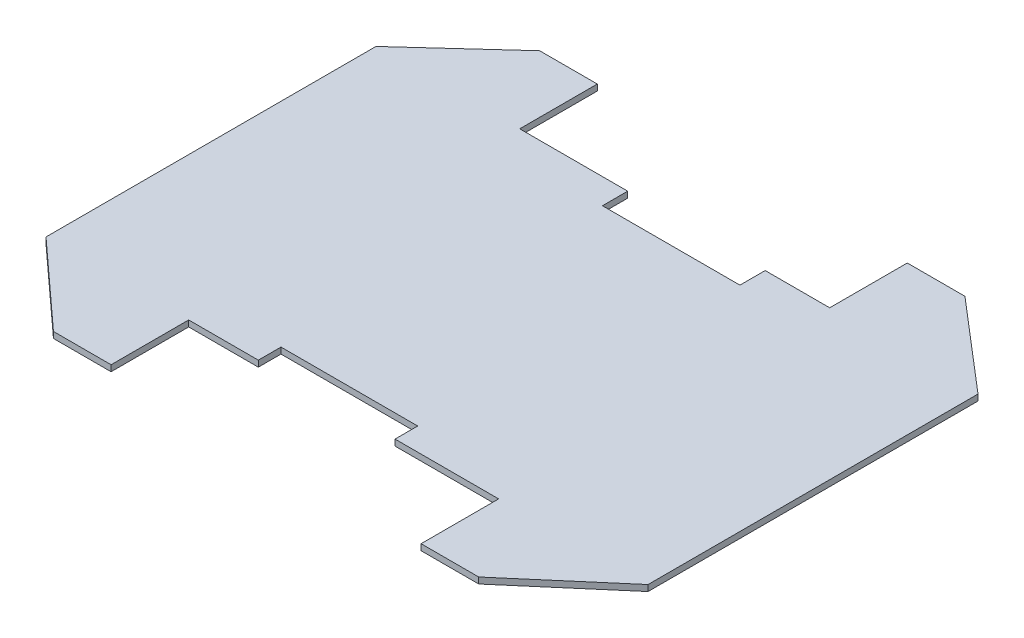
ISO-10303-21;
HEADER;
FILE_DESCRIPTION(('STEP AP214'),'2;1');
FILE_NAME('part.step','',(''),(''),'','','');
FILE_SCHEMA(('AUTOMOTIVE_DESIGN { 1 0 10303 214 1 1 1 1 }'));
ENDSEC;
DATA;
#1=APPLICATION_CONTEXT('core data for automotive mechanical design processes');
#2=APPLICATION_PROTOCOL_DEFINITION('international standard','automotive_design',2000,#1);
#3=PRODUCT_CONTEXT('',#1,'mechanical');
#4=PRODUCT('Part','Part','',(#3));
#5=PRODUCT_RELATED_PRODUCT_CATEGORY('part','',(#4));
#6=PRODUCT_DEFINITION_FORMATION('','',#4);
#7=PRODUCT_DEFINITION_CONTEXT('part definition',#1,'design');
#8=PRODUCT_DEFINITION('design','',#6,#7);
#9=PRODUCT_DEFINITION_SHAPE('','',#8);
#10=(LENGTH_UNIT() NAMED_UNIT(*) SI_UNIT(.MILLI.,.METRE.));
#11=(NAMED_UNIT(*) PLANE_ANGLE_UNIT() SI_UNIT($,.RADIAN.));
#12=(NAMED_UNIT(*) SI_UNIT($,.STERADIAN.) SOLID_ANGLE_UNIT());
#13=UNCERTAINTY_MEASURE_WITH_UNIT(LENGTH_MEASURE(1.E-05),#10,'distance_accuracy_value','');
#14=(GEOMETRIC_REPRESENTATION_CONTEXT(3) GLOBAL_UNCERTAINTY_ASSIGNED_CONTEXT((#13)) GLOBAL_UNIT_ASSIGNED_CONTEXT((#10,
#11,#12)) REPRESENTATION_CONTEXT('',''));
#15=CARTESIAN_POINT('',(0.,0.,0.));
#16=DIRECTION('',(0.,0.,1.));
#17=DIRECTION('',(1.,0.,0.));
#18=AXIS2_PLACEMENT_3D('',#15,#16,#17);
#19=CARTESIAN_POINT('',(-140.586469874335,5.5,-75.1414993078773));
#20=DIRECTION('',(0.,0.,1.));
#21=DIRECTION('',(1.,0.,0.));
#22=AXIS2_PLACEMENT_3D('',#19,#20,#21);
#23=PLANE('',#22);
#24=DIRECTION('',(-1.,0.,0.));
#25=VECTOR('',#24,1.);
#26=CARTESIAN_POINT('',(-140.586469874335,0.,-75.1414993078773));
#27=LINE('',#26,#25);
#28=CARTESIAN_POINT('',(-43.1697678383412,0.,-75.1414993078773));
#29=VERTEX_POINT('',#28);
#30=CARTESIAN_POINT('',(-140.586469874335,0.,-75.1414993078773));
#31=VERTEX_POINT('',#30);
#32=EDGE_CURVE('E223',#29,#31,#27,.T.);
#33=ORIENTED_EDGE('',*,*,#32,.T.);
#34=DIRECTION('',(0.,-1.,0.));
#35=VECTOR('',#34,1.);
#36=CARTESIAN_POINT('',(-140.586469874335,5.5,-75.1414993078773));
#37=LINE('',#36,#35);
#38=CARTESIAN_POINT('',(-140.586469874335,5.5,-75.1414993078773));
#39=VERTEX_POINT('',#38);
#40=EDGE_CURVE('E11',#39,#31,#37,.T.);
#41=ORIENTED_EDGE('',*,*,#40,.F.);
#42=DIRECTION('',(-1.,0.,0.));
#43=VECTOR('',#42,1.);
#44=CARTESIAN_POINT('',(-140.586469874335,5.5,-75.1414993078773));
#45=LINE('',#44,#43);
#46=CARTESIAN_POINT('',(-43.1697678383412,5.5,-75.1414993078773));
#47=VERTEX_POINT('',#46);
#48=EDGE_CURVE('E269',#47,#39,#45,.T.);
#49=ORIENTED_EDGE('',*,*,#48,.F.);
#50=DIRECTION('',(0.,-1.,0.));
#51=VECTOR('',#50,1.);
#52=CARTESIAN_POINT('',(-43.1697678383412,5.5,-75.1414993078773));
#53=LINE('',#52,#51);
#54=EDGE_CURVE('E219',#47,#29,#53,.T.);
#55=ORIENTED_EDGE('',*,*,#54,.T.);
#56=EDGE_LOOP('',(#33,#41,#49,#55));
#57=FACE_BOUND('',#56,.T.);
#58=ADVANCED_FACE('F31',(#57),#23,.F.);
#59=CARTESIAN_POINT('',(-140.586469874335,5.5,-75.1414993078773));
#60=DIRECTION('',(-1.,0.,0.));
#61=DIRECTION('',(0.,0.,1.));
#62=AXIS2_PLACEMENT_3D('',#59,#60,#61);
#63=PLANE('',#62);
#64=DIRECTION('',(0.,0.,-1.));
#65=VECTOR('',#64,1.);
#66=CARTESIAN_POINT('',(-140.586469874335,0.,-75.1414993078773));
#67=LINE('',#66,#65);
#68=CARTESIAN_POINT('',(-140.586469874335,0.,-145.141499307877));
#69=VERTEX_POINT('',#68);
#70=EDGE_CURVE('E226',#31,#69,#67,.T.);
#71=ORIENTED_EDGE('',*,*,#70,.T.);
#72=DIRECTION('',(0.,-1.,0.));
#73=VECTOR('',#72,1.);
#74=CARTESIAN_POINT('',(-140.586469874335,5.5,-145.141499307877));
#75=LINE('',#74,#73);
#76=CARTESIAN_POINT('',(-140.586469874335,5.5,-145.141499307877));
#77=VERTEX_POINT('',#76);
#78=EDGE_CURVE('E39',#77,#69,#75,.T.);
#79=ORIENTED_EDGE('',*,*,#78,.F.);
#80=DIRECTION('',(0.,0.,-1.));
#81=VECTOR('',#80,1.);
#82=CARTESIAN_POINT('',(-140.586469874335,5.5,-75.1414993078773));
#83=LINE('',#82,#81);
#84=EDGE_CURVE('E138',#39,#77,#83,.T.);
#85=ORIENTED_EDGE('',*,*,#84,.F.);
#86=ORIENTED_EDGE('',*,*,#40,.T.);
#87=EDGE_LOOP('',(#71,#79,#85,#86));
#88=FACE_BOUND('',#87,.T.);
#89=ADVANCED_FACE('F407',(#88),#63,.F.);
#90=CARTESIAN_POINT('',(-140.586469874335,5.5,-145.141499307877));
#91=DIRECTION('',(0.,0.,1.));
#92=DIRECTION('',(1.,0.,0.));
#93=AXIS2_PLACEMENT_3D('',#90,#91,#92);
#94=PLANE('',#93);
#95=DIRECTION('',(-1.,0.,0.));
#96=VECTOR('',#95,1.);
#97=CARTESIAN_POINT('',(-140.586469874335,0.,-145.141499307877));
#98=LINE('',#97,#96);
#99=CARTESIAN_POINT('',(-192.586469874335,0.,-145.141499307877));
#100=VERTEX_POINT('',#99);
#101=EDGE_CURVE('E228',#69,#100,#98,.T.);
#102=ORIENTED_EDGE('',*,*,#101,.T.);
#103=DIRECTION('',(0.,-1.,0.));
#104=VECTOR('',#103,1.);
#105=CARTESIAN_POINT('',(-192.586469874335,5.5,-145.141499307877));
#106=LINE('',#105,#104);
#107=CARTESIAN_POINT('',(-192.586469874335,5.5,-145.141499307877));
#108=VERTEX_POINT('',#107);
#109=EDGE_CURVE('E324',#108,#100,#106,.T.);
#110=ORIENTED_EDGE('',*,*,#109,.F.);
#111=DIRECTION('',(-1.,0.,0.));
#112=VECTOR('',#111,1.);
#113=CARTESIAN_POINT('',(-140.586469874335,5.5,-145.141499307877));
#114=LINE('',#113,#112);
#115=EDGE_CURVE('E332',#77,#108,#114,.T.);
#116=ORIENTED_EDGE('',*,*,#115,.F.);
#117=ORIENTED_EDGE('',*,*,#78,.T.);
#118=EDGE_LOOP('',(#102,#110,#116,#117));
#119=FACE_BOUND('',#118,.T.);
#120=ADVANCED_FACE('F330',(#119),#94,.F.);
#121=CARTESIAN_POINT('',(-269.792181600452,5.5,-74.6606808376328));
#122=DIRECTION('',(0.674210134413065,0.,0.738539568780655));
#123=DIRECTION('',(0.738539568780655,0.,-0.674210134413065));
#124=AXIS2_PLACEMENT_3D('',#121,#122,#123);
#125=PLANE('',#124);
#126=DIRECTION('',(-0.738539568780655,0.,0.674210134413065));
#127=VECTOR('',#126,1.);
#128=CARTESIAN_POINT('',(-269.792181600452,0.,-74.6606808376328));
#129=LINE('',#128,#127);
#130=CARTESIAN_POINT('',(-269.792181600452,0.,-74.6606808376328));
#131=VERTEX_POINT('',#130);
#132=EDGE_CURVE('E230',#100,#131,#129,.T.);
#133=ORIENTED_EDGE('',*,*,#132,.T.);
#134=DIRECTION('',(0.,-1.,0.));
#135=VECTOR('',#134,1.);
#136=CARTESIAN_POINT('',(-269.792181600452,5.5,-74.6606808376328));
#137=LINE('',#136,#135);
#138=CARTESIAN_POINT('',(-269.792181600452,5.5,-74.6606808376328));
#139=VERTEX_POINT('',#138);
#140=EDGE_CURVE('E321',#139,#131,#137,.T.);
#141=ORIENTED_EDGE('',*,*,#140,.F.);
#142=DIRECTION('',(-0.738539568780655,0.,0.674210134413065));
#143=VECTOR('',#142,1.);
#144=CARTESIAN_POINT('',(-269.792181600452,5.5,-74.6606808376328));
#145=LINE('',#144,#143);
#146=EDGE_CURVE('E350',#108,#139,#145,.T.);
#147=ORIENTED_EDGE('',*,*,#146,.F.);
#148=ORIENTED_EDGE('',*,*,#109,.T.);
#149=EDGE_LOOP('',(#133,#141,#147,#148));
#150=FACE_BOUND('',#149,.T.);
#151=ADVANCED_FACE('F341',(#150),#125,.F.);
#152=CARTESIAN_POINT('',(-269.792181600452,5.5,-74.6606808376328));
#153=DIRECTION('',(1.,0.,0.));
#154=DIRECTION('',(0.,0.,-1.));
#155=AXIS2_PLACEMENT_3D('',#152,#153,#154);
#156=PLANE('',#155);
#157=DIRECTION('',(0.,0.,1.));
#158=VECTOR('',#157,1.);
#159=CARTESIAN_POINT('',(-269.792181600452,0.,-74.6606808376328));
#160=LINE('',#159,#158);
#161=CARTESIAN_POINT('',(-269.792181600452,0.,223.012011978108));
#162=VERTEX_POINT('',#161);
#163=EDGE_CURVE('E232',#131,#162,#160,.T.);
#164=ORIENTED_EDGE('',*,*,#163,.T.);
#165=DIRECTION('',(0.,-1.,0.));
#166=VECTOR('',#165,1.);
#167=CARTESIAN_POINT('',(-269.792181600452,5.5,223.012011978108));
#168=LINE('',#167,#166);
#169=CARTESIAN_POINT('',(-269.792181600452,5.5,223.012011978108));
#170=VERTEX_POINT('',#169);
#171=EDGE_CURVE('E318',#170,#162,#168,.T.);
#172=ORIENTED_EDGE('',*,*,#171,.F.);
#173=DIRECTION('',(0.,0.,1.));
#174=VECTOR('',#173,1.);
#175=CARTESIAN_POINT('',(-269.792181600452,5.5,-74.6606808376328));
#176=LINE('',#175,#174);
#177=EDGE_CURVE('E347',#139,#170,#176,.T.);
#178=ORIENTED_EDGE('',*,*,#177,.F.);
#179=ORIENTED_EDGE('',*,*,#140,.T.);
#180=EDGE_LOOP('',(#164,#172,#178,#179));
#181=FACE_BOUND('',#180,.T.);
#182=ADVANCED_FACE('F345',(#181),#156,.F.);
#183=CARTESIAN_POINT('',(-269.792181600452,5.5,223.012011978108));
#184=DIRECTION('',(0.674210134413065,0.,-0.738539568780655));
#185=DIRECTION('',(-0.738539568780655,0.,-0.674210134413065));
#186=AXIS2_PLACEMENT_3D('',#183,#184,#185);
#187=PLANE('',#186);
#188=DIRECTION('',(0.738539568780655,0.,0.674210134413065));
#189=VECTOR('',#188,1.);
#190=CARTESIAN_POINT('',(-269.792181600452,0.,223.012011978108));
#191=LINE('',#190,#189);
#192=CARTESIAN_POINT('',(-192.586469874335,0.,293.492830448352));
#193=VERTEX_POINT('',#192);
#194=EDGE_CURVE('E234',#162,#193,#191,.T.);
#195=ORIENTED_EDGE('',*,*,#194,.T.);
#196=DIRECTION('',(0.,-1.,0.));
#197=VECTOR('',#196,1.);
#198=CARTESIAN_POINT('',(-192.586469874335,5.5,293.492830448352));
#199=LINE('',#198,#197);
#200=CARTESIAN_POINT('',(-192.586469874335,5.5,293.492830448352));
#201=VERTEX_POINT('',#200);
#202=EDGE_CURVE('E315',#201,#193,#199,.T.);
#203=ORIENTED_EDGE('',*,*,#202,.F.);
#204=DIRECTION('',(0.738539568780655,0.,0.674210134413065));
#205=VECTOR('',#204,1.);
#206=CARTESIAN_POINT('',(-269.792181600452,5.5,223.012011978108));
#207=LINE('',#206,#205);
#208=EDGE_CURVE('E349',#170,#201,#207,.T.);
#209=ORIENTED_EDGE('',*,*,#208,.F.);
#210=ORIENTED_EDGE('',*,*,#171,.T.);
#211=EDGE_LOOP('',(#195,#203,#209,#210));
#212=FACE_BOUND('',#211,.T.);
#213=ADVANCED_FACE('F420',(#212),#187,.F.);
#214=CARTESIAN_POINT('',(-140.586469874335,5.5,293.492830448352));
#215=DIRECTION('',(0.,0.,-1.));
#216=DIRECTION('',(-1.,0.,0.));
#217=AXIS2_PLACEMENT_3D('',#214,#215,#216);
#218=PLANE('',#217);
#219=DIRECTION('',(1.,0.,0.));
#220=VECTOR('',#219,1.);
#221=CARTESIAN_POINT('',(-140.586469874335,0.,293.492830448352));
#222=LINE('',#221,#220);
#223=CARTESIAN_POINT('',(-140.586469874335,0.,293.492830448352));
#224=VERTEX_POINT('',#223);
#225=EDGE_CURVE('E236',#193,#224,#222,.T.);
#226=ORIENTED_EDGE('',*,*,#225,.T.);
#227=DIRECTION('',(0.,-1.,0.));
#228=VECTOR('',#227,1.);
#229=CARTESIAN_POINT('',(-140.586469874335,5.5,293.492830448352));
#230=LINE('',#229,#228);
#231=CARTESIAN_POINT('',(-140.586469874335,5.5,293.492830448352));
#232=VERTEX_POINT('',#231);
#233=EDGE_CURVE('E312',#232,#224,#230,.T.);
#234=ORIENTED_EDGE('',*,*,#233,.F.);
#235=DIRECTION('',(1.,0.,0.));
#236=VECTOR('',#235,1.);
#237=CARTESIAN_POINT('',(-140.586469874335,5.5,293.492830448352));
#238=LINE('',#237,#236);
#239=EDGE_CURVE('E352',#201,#232,#238,.T.);
#240=ORIENTED_EDGE('',*,*,#239,.F.);
#241=ORIENTED_EDGE('',*,*,#202,.T.);
#242=EDGE_LOOP('',(#226,#234,#240,#241));
#243=FACE_BOUND('',#242,.T.);
#244=ADVANCED_FACE('F423',(#243),#218,.F.);
#245=CARTESIAN_POINT('',(-140.586469874335,5.5,223.492830448352));
#246=DIRECTION('',(-1.,0.,0.));
#247=DIRECTION('',(0.,0.,1.));
#248=AXIS2_PLACEMENT_3D('',#245,#246,#247);
#249=PLANE('',#248);
#250=DIRECTION('',(0.,0.,-1.));
#251=VECTOR('',#250,1.);
#252=CARTESIAN_POINT('',(-140.586469874335,0.,223.492830448352));
#253=LINE('',#252,#251);
#254=CARTESIAN_POINT('',(-140.586469874335,0.,223.492830448352));
#255=VERTEX_POINT('',#254);
#256=EDGE_CURVE('E238',#224,#255,#253,.T.);
#257=ORIENTED_EDGE('',*,*,#256,.T.);
#258=DIRECTION('',(0.,-1.,0.));
#259=VECTOR('',#258,1.);
#260=CARTESIAN_POINT('',(-140.586469874335,5.5,223.492830448352));
#261=LINE('',#260,#259);
#262=CARTESIAN_POINT('',(-140.586469874335,5.5,223.492830448352));
#263=VERTEX_POINT('',#262);
#264=EDGE_CURVE('E309',#263,#255,#261,.T.);
#265=ORIENTED_EDGE('',*,*,#264,.F.);
#266=DIRECTION('',(0.,0.,-1.));
#267=VECTOR('',#266,1.);
#268=CARTESIAN_POINT('',(-140.586469874335,5.5,223.492830448352));
#269=LINE('',#268,#267);
#270=EDGE_CURVE('E358',#232,#263,#269,.T.);
#271=ORIENTED_EDGE('',*,*,#270,.F.);
#272=ORIENTED_EDGE('',*,*,#233,.T.);
#273=EDGE_LOOP('',(#257,#265,#271,#272));
#274=FACE_BOUND('',#273,.T.);
#275=ADVANCED_FACE('F427',(#274),#249,.F.);
#276=CARTESIAN_POINT('',(-140.586469874335,5.5,223.492830448352));
#277=DIRECTION('',(0.,0.,-1.));
#278=DIRECTION('',(-1.,0.,0.));
#279=AXIS2_PLACEMENT_3D('',#276,#277,#278);
#280=PLANE('',#279);
#281=DIRECTION('',(1.,0.,0.));
#282=VECTOR('',#281,1.);
#283=CARTESIAN_POINT('',(-140.586469874335,0.,223.492830448352));
#284=LINE('',#283,#282);
#285=CARTESIAN_POINT('',(-77.7544293261489,0.,223.492830448352));
#286=VERTEX_POINT('',#285);
#287=EDGE_CURVE('E240',#255,#286,#284,.T.);
#288=ORIENTED_EDGE('',*,*,#287,.T.);
#289=DIRECTION('',(0.,-1.,0.));
#290=VECTOR('',#289,1.);
#291=CARTESIAN_POINT('',(-77.7544293261489,5.5,223.492830448352));
#292=LINE('',#291,#290);
#293=CARTESIAN_POINT('',(-77.7544293261489,5.5,223.492830448352));
#294=VERTEX_POINT('',#293);
#295=EDGE_CURVE('E306',#294,#286,#292,.T.);
#296=ORIENTED_EDGE('',*,*,#295,.F.);
#297=DIRECTION('',(1.,0.,0.));
#298=VECTOR('',#297,1.);
#299=CARTESIAN_POINT('',(-140.586469874335,5.5,223.492830448352));
#300=LINE('',#299,#298);
#301=EDGE_CURVE('E360',#263,#294,#300,.T.);
#302=ORIENTED_EDGE('',*,*,#301,.F.);
#303=ORIENTED_EDGE('',*,*,#264,.T.);
#304=EDGE_LOOP('',(#288,#296,#302,#303));
#305=FACE_BOUND('',#304,.T.);
#306=ADVANCED_FACE('F431',(#305),#280,.F.);
#307=CARTESIAN_POINT('',(-77.7544293261489,5.5,223.492830448352));
#308=DIRECTION('',(-1.,0.,0.));
#309=DIRECTION('',(0.,0.,1.));
#310=AXIS2_PLACEMENT_3D('',#307,#308,#309);
#311=PLANE('',#310);
#312=DIRECTION('',(0.,0.,-1.));
#313=VECTOR('',#312,1.);
#314=CARTESIAN_POINT('',(-77.7544293261489,0.,223.492830448352));
#315=LINE('',#314,#313);
#316=CARTESIAN_POINT('',(-77.7544293261489,0.,203.055820243155));
#317=VERTEX_POINT('',#316);
#318=EDGE_CURVE('E242',#286,#317,#315,.T.);
#319=ORIENTED_EDGE('',*,*,#318,.T.);
#320=DIRECTION('',(0.,-1.,0.));
#321=VECTOR('',#320,1.);
#322=CARTESIAN_POINT('',(-77.7544293261489,5.5,203.055820243155));
#323=LINE('',#322,#321);
#324=CARTESIAN_POINT('',(-77.7544293261489,5.5,203.055820243155));
#325=VERTEX_POINT('',#324);
#326=EDGE_CURVE('E303',#325,#317,#323,.T.);
#327=ORIENTED_EDGE('',*,*,#326,.F.);
#328=DIRECTION('',(0.,0.,-1.));
#329=VECTOR('',#328,1.);
#330=CARTESIAN_POINT('',(-77.7544293261489,5.5,223.492830448352));
#331=LINE('',#330,#329);
#332=EDGE_CURVE('E362',#294,#325,#331,.T.);
#333=ORIENTED_EDGE('',*,*,#332,.F.);
#334=ORIENTED_EDGE('',*,*,#295,.T.);
#335=EDGE_LOOP('',(#319,#327,#333,#334));
#336=FACE_BOUND('',#335,.T.);
#337=ADVANCED_FACE('F435',(#336),#311,.F.);
#338=CARTESIAN_POINT('',(-77.7544293261489,5.5,203.055820243155));
#339=DIRECTION('',(0.,0.,-1.));
#340=DIRECTION('',(-1.,0.,0.));
#341=AXIS2_PLACEMENT_3D('',#338,#339,#340);
#342=PLANE('',#341);
#343=DIRECTION('',(1.,0.,0.));
#344=VECTOR('',#343,1.);
#345=CARTESIAN_POINT('',(-77.7544293261489,0.,203.055820243155));
#346=LINE('',#345,#344);
#347=CARTESIAN_POINT('',(45.5874791792428,0.,203.055820243155));
#348=VERTEX_POINT('',#347);
#349=EDGE_CURVE('E244',#317,#348,#346,.T.);
#350=ORIENTED_EDGE('',*,*,#349,.T.);
#351=DIRECTION('',(0.,-1.,0.));
#352=VECTOR('',#351,1.);
#353=CARTESIAN_POINT('',(45.5874791792428,5.5,203.055820243155));
#354=LINE('',#353,#352);
#355=CARTESIAN_POINT('',(45.5874791792428,5.5,203.055820243155));
#356=VERTEX_POINT('',#355);
#357=EDGE_CURVE('E300',#356,#348,#354,.T.);
#358=ORIENTED_EDGE('',*,*,#357,.F.);
#359=DIRECTION('',(1.,0.,0.));
#360=VECTOR('',#359,1.);
#361=CARTESIAN_POINT('',(-77.7544293261489,5.5,203.055820243155));
#362=LINE('',#361,#360);
#363=EDGE_CURVE('E364',#325,#356,#362,.T.);
#364=ORIENTED_EDGE('',*,*,#363,.F.);
#365=ORIENTED_EDGE('',*,*,#326,.T.);
#366=EDGE_LOOP('',(#350,#358,#364,#365));
#367=FACE_BOUND('',#366,.T.);
#368=ADVANCED_FACE('F439',(#367),#342,.F.);
#369=CARTESIAN_POINT('',(45.5874791792428,5.5,203.055820243155));
#370=DIRECTION('',(1.,0.,0.));
#371=DIRECTION('',(0.,0.,-1.));
#372=AXIS2_PLACEMENT_3D('',#369,#370,#371);
#373=PLANE('',#372);
#374=DIRECTION('',(0.,0.,1.));
#375=VECTOR('',#374,1.);
#376=CARTESIAN_POINT('',(45.5874791792428,0.,203.055820243155));
#377=LINE('',#376,#375);
#378=CARTESIAN_POINT('',(45.5874791792428,0.,223.492830448352));
#379=VERTEX_POINT('',#378);
#380=EDGE_CURVE('E246',#348,#379,#377,.T.);
#381=ORIENTED_EDGE('',*,*,#380,.T.);
#382=DIRECTION('',(0.,-1.,0.));
#383=VECTOR('',#382,1.);
#384=CARTESIAN_POINT('',(45.5874791792428,5.5,223.492830448352));
#385=LINE('',#384,#383);
#386=CARTESIAN_POINT('',(45.5874791792428,5.5,223.492830448352));
#387=VERTEX_POINT('',#386);
#388=EDGE_CURVE('E297',#387,#379,#385,.T.);
#389=ORIENTED_EDGE('',*,*,#388,.F.);
#390=DIRECTION('',(0.,0.,1.));
#391=VECTOR('',#390,1.);
#392=CARTESIAN_POINT('',(45.5874791792428,5.5,203.055820243155));
#393=LINE('',#392,#391);
#394=EDGE_CURVE('E366',#356,#387,#393,.T.);
#395=ORIENTED_EDGE('',*,*,#394,.F.);
#396=ORIENTED_EDGE('',*,*,#357,.T.);
#397=EDGE_LOOP('',(#381,#389,#395,#396));
#398=FACE_BOUND('',#397,.T.);
#399=ADVANCED_FACE('F443',(#398),#373,.F.);
#400=CARTESIAN_POINT('',(45.5874791792428,5.5,223.492830448352));
#401=DIRECTION('',(0.,0.,-1.));
#402=DIRECTION('',(-1.,0.,0.));
#403=AXIS2_PLACEMENT_3D('',#400,#401,#402);
#404=PLANE('',#403);
#405=DIRECTION('',(1.,0.,0.));
#406=VECTOR('',#405,1.);
#407=CARTESIAN_POINT('',(45.5874791792428,0.,223.492830448352));
#408=LINE('',#407,#406);
#409=CARTESIAN_POINT('',(139.068300868454,0.,223.492830448352));
#410=VERTEX_POINT('',#409);
#411=EDGE_CURVE('E248',#379,#410,#408,.T.);
#412=ORIENTED_EDGE('',*,*,#411,.T.);
#413=DIRECTION('',(0.,-1.,0.));
#414=VECTOR('',#413,1.);
#415=CARTESIAN_POINT('',(139.068300868454,5.5,223.492830448352));
#416=LINE('',#415,#414);
#417=CARTESIAN_POINT('',(139.068300868454,5.5,223.492830448352));
#418=VERTEX_POINT('',#417);
#419=EDGE_CURVE('E294',#418,#410,#416,.T.);
#420=ORIENTED_EDGE('',*,*,#419,.F.);
#421=DIRECTION('',(1.,0.,0.));
#422=VECTOR('',#421,1.);
#423=CARTESIAN_POINT('',(45.5874791792428,5.5,223.492830448352));
#424=LINE('',#423,#422);
#425=EDGE_CURVE('E368',#387,#418,#424,.T.);
#426=ORIENTED_EDGE('',*,*,#425,.F.);
#427=ORIENTED_EDGE('',*,*,#388,.T.);
#428=EDGE_LOOP('',(#412,#420,#426,#427));
#429=FACE_BOUND('',#428,.T.);
#430=ADVANCED_FACE('F447',(#429),#404,.F.);
#431=CARTESIAN_POINT('',(139.068300868454,5.5,223.492830448352));
#432=DIRECTION('',(1.,0.,0.));
#433=DIRECTION('',(0.,0.,-1.));
#434=AXIS2_PLACEMENT_3D('',#431,#432,#433);
#435=PLANE('',#434);
#436=DIRECTION('',(0.,0.,1.));
#437=VECTOR('',#436,1.);
#438=CARTESIAN_POINT('',(139.068300868454,0.,223.492830448352));
#439=LINE('',#438,#437);
#440=CARTESIAN_POINT('',(139.068300868454,0.,293.492830448352));
#441=VERTEX_POINT('',#440);
#442=EDGE_CURVE('E250',#410,#441,#439,.T.);
#443=ORIENTED_EDGE('',*,*,#442,.T.);
#444=DIRECTION('',(0.,-1.,0.));
#445=VECTOR('',#444,1.);
#446=CARTESIAN_POINT('',(139.068300868454,5.5,293.492830448352));
#447=LINE('',#446,#445);
#448=CARTESIAN_POINT('',(139.068300868454,5.5,293.492830448352));
#449=VERTEX_POINT('',#448);
#450=EDGE_CURVE('E291',#449,#441,#447,.T.);
#451=ORIENTED_EDGE('',*,*,#450,.F.);
#452=DIRECTION('',(0.,0.,1.));
#453=VECTOR('',#452,1.);
#454=CARTESIAN_POINT('',(139.068300868454,5.5,223.492830448352));
#455=LINE('',#454,#453);
#456=EDGE_CURVE('E370',#418,#449,#455,.T.);
#457=ORIENTED_EDGE('',*,*,#456,.F.);
#458=ORIENTED_EDGE('',*,*,#419,.T.);
#459=EDGE_LOOP('',(#443,#451,#457,#458));
#460=FACE_BOUND('',#459,.T.);
#461=ADVANCED_FACE('F451',(#460),#435,.F.);
#462=CARTESIAN_POINT('',(139.068300868454,5.5,293.492830448352));
#463=DIRECTION('',(0.,0.,-1.));
#464=DIRECTION('',(-1.,0.,0.));
#465=AXIS2_PLACEMENT_3D('',#462,#463,#464);
#466=PLANE('',#465);
#467=DIRECTION('',(1.,0.,0.));
#468=VECTOR('',#467,1.);
#469=CARTESIAN_POINT('',(139.068300868454,0.,293.492830448352));
#470=LINE('',#469,#468);
#471=CARTESIAN_POINT('',(191.068300868454,0.,293.492830448352));
#472=VERTEX_POINT('',#471);
#473=EDGE_CURVE('E252',#441,#472,#470,.T.);
#474=ORIENTED_EDGE('',*,*,#473,.T.);
#475=DIRECTION('',(0.,-1.,0.));
#476=VECTOR('',#475,1.);
#477=CARTESIAN_POINT('',(191.068300868454,5.5,293.492830448352));
#478=LINE('',#477,#476);
#479=CARTESIAN_POINT('',(191.068300868454,5.5,293.492830448352));
#480=VERTEX_POINT('',#479);
#481=EDGE_CURVE('E288',#480,#472,#478,.T.);
#482=ORIENTED_EDGE('',*,*,#481,.F.);
#483=DIRECTION('',(1.,0.,0.));
#484=VECTOR('',#483,1.);
#485=CARTESIAN_POINT('',(139.068300868454,5.5,293.492830448352));
#486=LINE('',#485,#484);
#487=EDGE_CURVE('E372',#449,#480,#486,.T.);
#488=ORIENTED_EDGE('',*,*,#487,.F.);
#489=ORIENTED_EDGE('',*,*,#450,.T.);
#490=EDGE_LOOP('',(#474,#482,#488,#489));
#491=FACE_BOUND('',#490,.T.);
#492=ADVANCED_FACE('F455',(#491),#466,.F.);
#493=CARTESIAN_POINT('',(273.341577688739,5.5,223.012011978108));
#494=DIRECTION('',(-0.650583114259423,0.,-0.759435060713232));
#495=DIRECTION('',(-0.759435060713232,0.,0.650583114259423));
#496=AXIS2_PLACEMENT_3D('',#493,#494,#495);
#497=PLANE('',#496);
#498=DIRECTION('',(0.759435060713232,0.,-0.650583114259423));
#499=VECTOR('',#498,1.);
#500=CARTESIAN_POINT('',(273.341577688739,0.,223.012011978108));
#501=LINE('',#500,#499);
#502=CARTESIAN_POINT('',(273.341577688739,0.,223.012011978108));
#503=VERTEX_POINT('',#502);
#504=EDGE_CURVE('E254',#472,#503,#501,.T.);
#505=ORIENTED_EDGE('',*,*,#504,.T.);
#506=DIRECTION('',(0.,-1.,0.));
#507=VECTOR('',#506,1.);
#508=CARTESIAN_POINT('',(273.341577688739,5.5,223.012011978108));
#509=LINE('',#508,#507);
#510=CARTESIAN_POINT('',(273.341577688739,5.5,223.012011978108));
#511=VERTEX_POINT('',#510);
#512=EDGE_CURVE('E285',#511,#503,#509,.T.);
#513=ORIENTED_EDGE('',*,*,#512,.F.);
#514=DIRECTION('',(0.759435060713232,0.,-0.650583114259423));
#515=VECTOR('',#514,1.);
#516=CARTESIAN_POINT('',(273.341577688739,5.5,223.012011978108));
#517=LINE('',#516,#515);
#518=EDGE_CURVE('E374',#480,#511,#517,.T.);
#519=ORIENTED_EDGE('',*,*,#518,.F.);
#520=ORIENTED_EDGE('',*,*,#481,.T.);
#521=EDGE_LOOP('',(#505,#513,#519,#520));
#522=FACE_BOUND('',#521,.T.);
#523=ADVANCED_FACE('F459',(#522),#497,.F.);
#524=CARTESIAN_POINT('',(273.341577688739,5.5,-74.6606808376329));
#525=DIRECTION('',(-1.,0.,0.));
#526=DIRECTION('',(0.,0.,1.));
#527=AXIS2_PLACEMENT_3D('',#524,#525,#526);
#528=PLANE('',#527);
#529=DIRECTION('',(0.,0.,-1.));
#530=VECTOR('',#529,1.);
#531=CARTESIAN_POINT('',(273.341577688739,0.,-74.6606808376329));
#532=LINE('',#531,#530);
#533=CARTESIAN_POINT('',(273.341577688739,0.,-74.6606808376329));
#534=VERTEX_POINT('',#533);
#535=EDGE_CURVE('E256',#503,#534,#532,.T.);
#536=ORIENTED_EDGE('',*,*,#535,.T.);
#537=DIRECTION('',(0.,-1.,0.));
#538=VECTOR('',#537,1.);
#539=CARTESIAN_POINT('',(273.341577688739,5.5,-74.6606808376329));
#540=LINE('',#539,#538);
#541=CARTESIAN_POINT('',(273.341577688739,5.5,-74.6606808376329));
#542=VERTEX_POINT('',#541);
#543=EDGE_CURVE('E282',#542,#534,#540,.T.);
#544=ORIENTED_EDGE('',*,*,#543,.F.);
#545=DIRECTION('',(0.,0.,-1.));
#546=VECTOR('',#545,1.);
#547=CARTESIAN_POINT('',(273.341577688739,5.5,-74.6606808376329));
#548=LINE('',#547,#546);
#549=EDGE_CURVE('E376',#511,#542,#548,.T.);
#550=ORIENTED_EDGE('',*,*,#549,.F.);
#551=ORIENTED_EDGE('',*,*,#512,.T.);
#552=EDGE_LOOP('',(#536,#544,#550,#551));
#553=FACE_BOUND('',#552,.T.);
#554=ADVANCED_FACE('F463',(#553),#528,.F.);
#555=CARTESIAN_POINT('',(273.341577688739,5.5,-74.6606808376329));
#556=DIRECTION('',(-0.650583114259423,0.,0.759435060713232));
#557=DIRECTION('',(0.759435060713232,0.,0.650583114259423));
#558=AXIS2_PLACEMENT_3D('',#555,#556,#557);
#559=PLANE('',#558);
#560=DIRECTION('',(-0.759435060713232,0.,-0.650583114259423));
#561=VECTOR('',#560,1.);
#562=CARTESIAN_POINT('',(273.341577688739,0.,-74.6606808376329));
#563=LINE('',#562,#561);
#564=CARTESIAN_POINT('',(191.068300868454,0.,-145.141499307877));
#565=VERTEX_POINT('',#564);
#566=EDGE_CURVE('E258',#534,#565,#563,.T.);
#567=ORIENTED_EDGE('',*,*,#566,.T.);
#568=DIRECTION('',(0.,-1.,0.));
#569=VECTOR('',#568,1.);
#570=CARTESIAN_POINT('',(191.068300868454,5.5,-145.141499307877));
#571=LINE('',#570,#569);
#572=CARTESIAN_POINT('',(191.068300868454,5.5,-145.141499307877));
#573=VERTEX_POINT('',#572);
#574=EDGE_CURVE('E279',#573,#565,#571,.T.);
#575=ORIENTED_EDGE('',*,*,#574,.F.);
#576=DIRECTION('',(-0.759435060713232,0.,-0.650583114259423));
#577=VECTOR('',#576,1.);
#578=CARTESIAN_POINT('',(273.341577688739,5.5,-74.6606808376329));
#579=LINE('',#578,#577);
#580=EDGE_CURVE('E378',#542,#573,#579,.T.);
#581=ORIENTED_EDGE('',*,*,#580,.F.);
#582=ORIENTED_EDGE('',*,*,#543,.T.);
#583=EDGE_LOOP('',(#567,#575,#581,#582));
#584=FACE_BOUND('',#583,.T.);
#585=ADVANCED_FACE('F467',(#584),#559,.F.);
#586=CARTESIAN_POINT('',(139.068300868454,5.5,-145.141499307877));
#587=DIRECTION('',(0.,0.,1.));
#588=DIRECTION('',(1.,0.,0.));
#589=AXIS2_PLACEMENT_3D('',#586,#587,#588);
#590=PLANE('',#589);
#591=DIRECTION('',(-1.,0.,0.));
#592=VECTOR('',#591,1.);
#593=CARTESIAN_POINT('',(139.068300868454,0.,-145.141499307877));
#594=LINE('',#593,#592);
#595=CARTESIAN_POINT('',(139.068300868454,0.,-145.141499307877));
#596=VERTEX_POINT('',#595);
#597=EDGE_CURVE('E260',#565,#596,#594,.T.);
#598=ORIENTED_EDGE('',*,*,#597,.T.);
#599=DIRECTION('',(0.,-1.,0.));
#600=VECTOR('',#599,1.);
#601=CARTESIAN_POINT('',(139.068300868454,5.5,-145.141499307877));
#602=LINE('',#601,#600);
#603=CARTESIAN_POINT('',(139.068300868454,5.5,-145.141499307877));
#604=VERTEX_POINT('',#603);
#605=EDGE_CURVE('E276',#604,#596,#602,.T.);
#606=ORIENTED_EDGE('',*,*,#605,.F.);
#607=DIRECTION('',(-1.,0.,0.));
#608=VECTOR('',#607,1.);
#609=CARTESIAN_POINT('',(139.068300868454,5.5,-145.141499307877));
#610=LINE('',#609,#608);
#611=EDGE_CURVE('E380',#573,#604,#610,.T.);
#612=ORIENTED_EDGE('',*,*,#611,.F.);
#613=ORIENTED_EDGE('',*,*,#574,.T.);
#614=EDGE_LOOP('',(#598,#606,#612,#613));
#615=FACE_BOUND('',#614,.T.);
#616=ADVANCED_FACE('F471',(#615),#590,.F.);
#617=CARTESIAN_POINT('',(139.068300868454,5.5,-75.1414993078773));
#618=DIRECTION('',(1.,0.,0.));
#619=DIRECTION('',(0.,0.,-1.));
#620=AXIS2_PLACEMENT_3D('',#617,#618,#619);
#621=PLANE('',#620);
#622=DIRECTION('',(0.,0.,1.));
#623=VECTOR('',#622,1.);
#624=CARTESIAN_POINT('',(139.068300868454,0.,-75.1414993078773));
#625=LINE('',#624,#623);
#626=CARTESIAN_POINT('',(139.068300868454,0.,-75.1414993078773));
#627=VERTEX_POINT('',#626);
#628=EDGE_CURVE('E262',#596,#627,#625,.T.);
#629=ORIENTED_EDGE('',*,*,#628,.T.);
#630=DIRECTION('',(0.,-1.,0.));
#631=VECTOR('',#630,1.);
#632=CARTESIAN_POINT('',(139.068300868454,5.5,-75.1414993078773));
#633=LINE('',#632,#631);
#634=CARTESIAN_POINT('',(139.068300868454,5.5,-75.1414993078773));
#635=VERTEX_POINT('',#634);
#636=EDGE_CURVE('E273',#635,#627,#633,.T.);
#637=ORIENTED_EDGE('',*,*,#636,.F.);
#638=DIRECTION('',(0.,0.,1.));
#639=VECTOR('',#638,1.);
#640=CARTESIAN_POINT('',(139.068300868454,5.5,-75.1414993078773));
#641=LINE('',#640,#639);
#642=EDGE_CURVE('E382',#604,#635,#641,.T.);
#643=ORIENTED_EDGE('',*,*,#642,.F.);
#644=ORIENTED_EDGE('',*,*,#605,.T.);
#645=EDGE_LOOP('',(#629,#637,#643,#644));
#646=FACE_BOUND('',#645,.T.);
#647=ADVANCED_FACE('F388',(#646),#621,.F.);
#648=CARTESIAN_POINT('',(80.8757057426508,5.5,-75.1414993078773));
#649=DIRECTION('',(0.,0.,1.));
#650=DIRECTION('',(1.,0.,0.));
#651=AXIS2_PLACEMENT_3D('',#648,#649,#650);
#652=PLANE('',#651);
#653=DIRECTION('',(-1.,0.,0.));
#654=VECTOR('',#653,1.);
#655=CARTESIAN_POINT('',(80.8757057426508,0.,-75.1414993078773));
#656=LINE('',#655,#654);
#657=CARTESIAN_POINT('',(80.8757057426508,0.,-75.1414993078773));
#658=VERTEX_POINT('',#657);
#659=EDGE_CURVE('E264',#627,#658,#656,.T.);
#660=ORIENTED_EDGE('',*,*,#659,.T.);
#661=DIRECTION('',(0.,-1.,0.));
#662=VECTOR('',#661,1.);
#663=CARTESIAN_POINT('',(80.8757057426508,5.5,-75.1414993078773));
#664=LINE('',#663,#662);
#665=CARTESIAN_POINT('',(80.8757057426508,5.5,-75.1414993078773));
#666=VERTEX_POINT('',#665);
#667=EDGE_CURVE('E214',#666,#658,#664,.T.);
#668=ORIENTED_EDGE('',*,*,#667,.F.);
#669=DIRECTION('',(-1.,0.,0.));
#670=VECTOR('',#669,1.);
#671=CARTESIAN_POINT('',(80.8757057426508,5.5,-75.1414993078773));
#672=LINE('',#671,#670);
#673=EDGE_CURVE('E205',#635,#666,#672,.T.);
#674=ORIENTED_EDGE('',*,*,#673,.F.);
#675=ORIENTED_EDGE('',*,*,#636,.T.);
#676=EDGE_LOOP('',(#660,#668,#674,#675));
#677=FACE_BOUND('',#676,.T.);
#678=ADVANCED_FACE('F392',(#677),#652,.F.);
#679=CARTESIAN_POINT('',(80.8757057426508,5.5,-52.3492346455395));
#680=DIRECTION('',(1.,0.,0.));
#681=DIRECTION('',(0.,0.,-1.));
#682=AXIS2_PLACEMENT_3D('',#679,#680,#681);
#683=PLANE('',#682);
#684=DIRECTION('',(0.,0.,1.));
#685=VECTOR('',#684,1.);
#686=CARTESIAN_POINT('',(80.8757057426508,0.,-52.3492346455395));
#687=LINE('',#686,#685);
#688=CARTESIAN_POINT('',(80.8757057426508,0.,-52.3492346455395));
#689=VERTEX_POINT('',#688);
#690=EDGE_CURVE('E213',#658,#689,#687,.T.);
#691=ORIENTED_EDGE('',*,*,#690,.T.);
#692=DIRECTION('',(0.,-1.,0.));
#693=VECTOR('',#692,1.);
#694=CARTESIAN_POINT('',(80.8757057426508,5.5,-52.3492346455395));
#695=LINE('',#694,#693);
#696=CARTESIAN_POINT('',(80.8757057426508,5.5,-52.3492346455395));
#697=VERTEX_POINT('',#696);
#698=EDGE_CURVE('E210',#697,#689,#695,.T.);
#699=ORIENTED_EDGE('',*,*,#698,.F.);
#700=DIRECTION('',(0.,0.,1.));
#701=VECTOR('',#700,1.);
#702=CARTESIAN_POINT('',(80.8757057426508,5.5,-52.3492346455395));
#703=LINE('',#702,#701);
#704=EDGE_CURVE('E199',#666,#697,#703,.T.);
#705=ORIENTED_EDGE('',*,*,#704,.F.);
#706=ORIENTED_EDGE('',*,*,#667,.T.);
#707=EDGE_LOOP('',(#691,#699,#705,#706));
#708=FACE_BOUND('',#707,.T.);
#709=ADVANCED_FACE('F211',(#708),#683,.F.);
#710=CARTESIAN_POINT('',(-43.1697678383412,5.5,-52.3492346455395));
#711=DIRECTION('',(0.,0.,1.));
#712=DIRECTION('',(1.,0.,0.));
#713=AXIS2_PLACEMENT_3D('',#710,#711,#712);
#714=PLANE('',#713);
#715=DIRECTION('',(-1.,0.,0.));
#716=VECTOR('',#715,1.);
#717=CARTESIAN_POINT('',(-43.1697678383412,0.,-52.3492346455395));
#718=LINE('',#717,#716);
#719=CARTESIAN_POINT('',(-43.1697678383412,0.,-52.3492346455395));
#720=VERTEX_POINT('',#719);
#721=EDGE_CURVE('E124',#689,#720,#718,.T.);
#722=ORIENTED_EDGE('',*,*,#721,.T.);
#723=DIRECTION('',(0.,-1.,0.));
#724=VECTOR('',#723,1.);
#725=CARTESIAN_POINT('',(-43.1697678383412,5.5,-52.3492346455395));
#726=LINE('',#725,#724);
#727=CARTESIAN_POINT('',(-43.1697678383412,5.5,-52.3492346455395));
#728=VERTEX_POINT('',#727);
#729=EDGE_CURVE('E215',#728,#720,#726,.T.);
#730=ORIENTED_EDGE('',*,*,#729,.F.);
#731=DIRECTION('',(-1.,0.,0.));
#732=VECTOR('',#731,1.);
#733=CARTESIAN_POINT('',(-43.1697678383412,5.5,-52.3492346455395));
#734=LINE('',#733,#732);
#735=EDGE_CURVE('E203',#697,#728,#734,.T.);
#736=ORIENTED_EDGE('',*,*,#735,.F.);
#737=ORIENTED_EDGE('',*,*,#698,.T.);
#738=EDGE_LOOP('',(#722,#730,#736,#737));
#739=FACE_BOUND('',#738,.T.);
#740=ADVANCED_FACE('F217',(#739),#714,.F.);
#741=CARTESIAN_POINT('',(-43.1697678383412,5.5,-75.1414993078773));
#742=DIRECTION('',(-1.,0.,0.));
#743=DIRECTION('',(0.,0.,1.));
#744=AXIS2_PLACEMENT_3D('',#741,#742,#743);
#745=PLANE('',#744);
#746=DIRECTION('',(0.,0.,-1.));
#747=VECTOR('',#746,1.);
#748=CARTESIAN_POINT('',(-43.1697678383412,0.,-75.1414993078773));
#749=LINE('',#748,#747);
#750=EDGE_CURVE('E130',#720,#29,#749,.T.);
#751=ORIENTED_EDGE('',*,*,#750,.T.);
#752=ORIENTED_EDGE('',*,*,#54,.F.);
#753=DIRECTION('',(0.,0.,-1.));
#754=VECTOR('',#753,1.);
#755=CARTESIAN_POINT('',(-43.1697678383412,5.5,-75.1414993078773));
#756=LINE('',#755,#754);
#757=EDGE_CURVE('E47',#728,#47,#756,.T.);
#758=ORIENTED_EDGE('',*,*,#757,.F.);
#759=ORIENTED_EDGE('',*,*,#729,.T.);
#760=EDGE_LOOP('',(#751,#752,#758,#759));
#761=FACE_BOUND('',#760,.T.);
#762=ADVANCED_FACE('F396',(#761),#745,.F.);
#763=CARTESIAN_POINT('',(-43.1697678383412,5.5,-75.1414993078773));
#764=DIRECTION('',(0.,-1.,0.));
#765=DIRECTION('',(0.,0.,-1.));
#766=AXIS2_PLACEMENT_3D('',#763,#764,#765);
#767=PLANE('',#766);
#768=ORIENTED_EDGE('',*,*,#48,.T.);
#769=ORIENTED_EDGE('',*,*,#84,.T.);
#770=ORIENTED_EDGE('',*,*,#115,.T.);
#771=ORIENTED_EDGE('',*,*,#146,.T.);
#772=ORIENTED_EDGE('',*,*,#177,.T.);
#773=ORIENTED_EDGE('',*,*,#208,.T.);
#774=ORIENTED_EDGE('',*,*,#239,.T.);
#775=ORIENTED_EDGE('',*,*,#270,.T.);
#776=ORIENTED_EDGE('',*,*,#301,.T.);
#777=ORIENTED_EDGE('',*,*,#332,.T.);
#778=ORIENTED_EDGE('',*,*,#363,.T.);
#779=ORIENTED_EDGE('',*,*,#394,.T.);
#780=ORIENTED_EDGE('',*,*,#425,.T.);
#781=ORIENTED_EDGE('',*,*,#456,.T.);
#782=ORIENTED_EDGE('',*,*,#487,.T.);
#783=ORIENTED_EDGE('',*,*,#518,.T.);
#784=ORIENTED_EDGE('',*,*,#549,.T.);
#785=ORIENTED_EDGE('',*,*,#580,.T.);
#786=ORIENTED_EDGE('',*,*,#611,.T.);
#787=ORIENTED_EDGE('',*,*,#642,.T.);
#788=ORIENTED_EDGE('',*,*,#673,.T.);
#789=ORIENTED_EDGE('',*,*,#704,.T.);
#790=ORIENTED_EDGE('',*,*,#735,.T.);
#791=ORIENTED_EDGE('',*,*,#757,.T.);
#792=EDGE_LOOP('',(#768,#769,#770,#771,#772,#773,#774,#775,#776,#777,#778,#779,#780,#781,#782,
#783,#784,#785,#786,#787,#788,#789,#790,#791));
#793=FACE_BOUND('',#792,.T.);
#794=ADVANCED_FACE('F201',(#793),#767,.F.);
#795=CARTESIAN_POINT('',(-43.1697678383412,0.,-75.1414993078773));
#796=DIRECTION('',(0.,-1.,0.));
#797=DIRECTION('',(0.,0.,-1.));
#798=AXIS2_PLACEMENT_3D('',#795,#796,#797);
#799=PLANE('',#798);
#800=ORIENTED_EDGE('',*,*,#32,.F.);
#801=ORIENTED_EDGE('',*,*,#750,.F.);
#802=ORIENTED_EDGE('',*,*,#721,.F.);
#803=ORIENTED_EDGE('',*,*,#690,.F.);
#804=ORIENTED_EDGE('',*,*,#659,.F.);
#805=ORIENTED_EDGE('',*,*,#628,.F.);
#806=ORIENTED_EDGE('',*,*,#597,.F.);
#807=ORIENTED_EDGE('',*,*,#566,.F.);
#808=ORIENTED_EDGE('',*,*,#535,.F.);
#809=ORIENTED_EDGE('',*,*,#504,.F.);
#810=ORIENTED_EDGE('',*,*,#473,.F.);
#811=ORIENTED_EDGE('',*,*,#442,.F.);
#812=ORIENTED_EDGE('',*,*,#411,.F.);
#813=ORIENTED_EDGE('',*,*,#380,.F.);
#814=ORIENTED_EDGE('',*,*,#349,.F.);
#815=ORIENTED_EDGE('',*,*,#318,.F.);
#816=ORIENTED_EDGE('',*,*,#287,.F.);
#817=ORIENTED_EDGE('',*,*,#256,.F.);
#818=ORIENTED_EDGE('',*,*,#225,.F.);
#819=ORIENTED_EDGE('',*,*,#194,.F.);
#820=ORIENTED_EDGE('',*,*,#163,.F.);
#821=ORIENTED_EDGE('',*,*,#132,.F.);
#822=ORIENTED_EDGE('',*,*,#101,.F.);
#823=ORIENTED_EDGE('',*,*,#70,.F.);
#824=EDGE_LOOP('',(#800,#801,#802,#803,#804,#805,#806,#807,#808,#809,#810,#811,#812,#813,#814,
#815,#816,#817,#818,#819,#820,#821,#822,#823));
#825=FACE_BOUND('',#824,.T.);
#826=ADVANCED_FACE('F336',(#825),#799,.T.);
#827=CLOSED_SHELL('',(#58,#89,#120,#151,#182,#213,#244,#275,#306,#337,#368,#399,#430,#461,#492,
#523,#554,#585,#616,#647,#678,#709,#740,#762,#794,#826));
#828=MANIFOLD_SOLID_BREP('B2',#827);
#829=ADVANCED_BREP_SHAPE_REPRESENTATION('',(#18,#828),#14);
#830=SHAPE_DEFINITION_REPRESENTATION(#9,#829);
ENDSEC;
END-ISO-10303-21;
